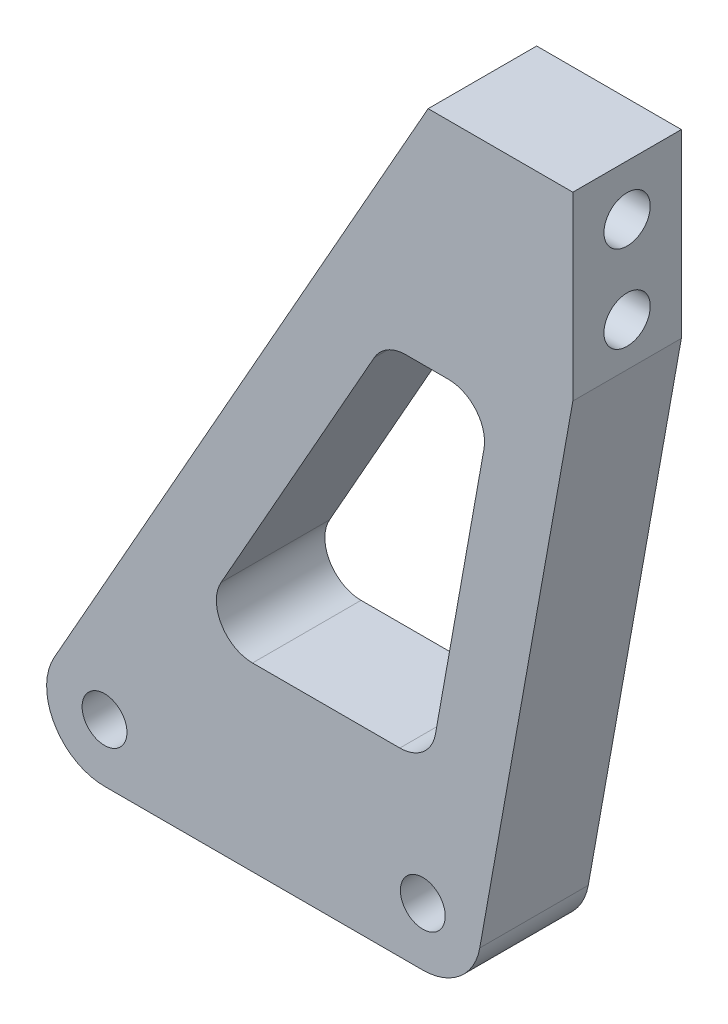
ISO-10303-21;
HEADER;
FILE_DESCRIPTION(('STEP AP214'),'2;1');
FILE_NAME('part.step','',(''),(''),'','','');
FILE_SCHEMA(('AUTOMOTIVE_DESIGN { 1 0 10303 214 1 1 1 1 }'));
ENDSEC;
DATA;
#1=APPLICATION_CONTEXT('core data for automotive mechanical design processes');
#2=APPLICATION_PROTOCOL_DEFINITION('international standard','automotive_design',2000,#1);
#3=PRODUCT_CONTEXT('',#1,'mechanical');
#4=PRODUCT('Part','Part','',(#3));
#5=PRODUCT_RELATED_PRODUCT_CATEGORY('part','',(#4));
#6=PRODUCT_DEFINITION_FORMATION('','',#4);
#7=PRODUCT_DEFINITION_CONTEXT('part definition',#1,'design');
#8=PRODUCT_DEFINITION('design','',#6,#7);
#9=PRODUCT_DEFINITION_SHAPE('','',#8);
#10=(LENGTH_UNIT() NAMED_UNIT(*) SI_UNIT(.MILLI.,.METRE.));
#11=(NAMED_UNIT(*) PLANE_ANGLE_UNIT() SI_UNIT($,.RADIAN.));
#12=(NAMED_UNIT(*) SI_UNIT($,.STERADIAN.) SOLID_ANGLE_UNIT());
#13=UNCERTAINTY_MEASURE_WITH_UNIT(LENGTH_MEASURE(1.E-05),#10,'distance_accuracy_value','');
#14=(GEOMETRIC_REPRESENTATION_CONTEXT(3) GLOBAL_UNCERTAINTY_ASSIGNED_CONTEXT((#13)) GLOBAL_UNIT_ASSIGNED_CONTEXT((#10,
#11,#12)) REPRESENTATION_CONTEXT('',''));
#15=CARTESIAN_POINT('',(0.,0.,0.));
#16=DIRECTION('',(0.,0.,1.));
#17=DIRECTION('',(1.,0.,0.));
#18=AXIS2_PLACEMENT_3D('',#15,#16,#17);
#19=CARTESIAN_POINT('',(11.,0.,7.5));
#20=DIRECTION('',(0.,0.,-1.));
#21=DIRECTION('',(-1.,0.,0.));
#22=AXIS2_PLACEMENT_3D('',#19,#20,#21);
#23=CYLINDRICAL_SURFACE('',#22,4.);
#24=DIRECTION('',(0.,0.,1.));
#25=VECTOR('',#24,1.);
#26=CARTESIAN_POINT('',(14.9374811143085,-0.704444798734167,-60.2766468081744));
#27=LINE('',#26,#25);
#28=CARTESIAN_POINT('',(14.9374811143085,-0.704444798734167,0.));
#29=VERTEX_POINT('',#28);
#30=CARTESIAN_POINT('',(14.9374811143085,-0.704444798734167,7.5));
#31=VERTEX_POINT('',#30);
#32=EDGE_CURVE('E181',#29,#31,#27,.T.);
#33=ORIENTED_EDGE('',*,*,#32,.T.);
#34=CARTESIAN_POINT('',(11.,0.,7.5));
#35=DIRECTION('',(0.,0.,1.));
#36=DIRECTION('',(1.,0.,0.));
#37=AXIS2_PLACEMENT_3D('',#34,#35,#36);
#38=CIRCLE('',#37,4.);
#39=CARTESIAN_POINT('',(11.,-3.99999999999999,7.5));
#40=VERTEX_POINT('',#39);
#41=EDGE_CURVE('E170',#40,#31,#38,.T.);
#42=ORIENTED_EDGE('',*,*,#41,.F.);
#43=DIRECTION('',(0.,0.,-1.));
#44=VECTOR('',#43,1.);
#45=CARTESIAN_POINT('',(11.,-3.99999999999999,7.5));
#46=LINE('',#45,#44);
#47=CARTESIAN_POINT('',(11.,-3.99999999999999,0.));
#48=VERTEX_POINT('',#47);
#49=EDGE_CURVE('E219',#40,#48,#46,.T.);
#50=ORIENTED_EDGE('',*,*,#49,.T.);
#51=CARTESIAN_POINT('',(11.,0.,0.));
#52=DIRECTION('',(0.,0.,1.));
#53=DIRECTION('',(1.,0.,0.));
#54=AXIS2_PLACEMENT_3D('',#51,#52,#53);
#55=CIRCLE('',#54,4.);
#56=EDGE_CURVE('E214',#48,#29,#55,.T.);
#57=ORIENTED_EDGE('',*,*,#56,.T.);
#58=EDGE_LOOP('',(#33,#42,#50,#57));
#59=FACE_BOUND('',#58,.T.);
#60=ADVANCED_FACE('F34',(#59),#23,.T.);
#61=CARTESIAN_POINT('',(0.,-4.,7.5));
#62=DIRECTION('',(0.,1.,0.));
#63=DIRECTION('',(-1.,0.,0.));
#64=AXIS2_PLACEMENT_3D('',#61,#62,#63);
#65=PLANE('',#64);
#66=DIRECTION('',(1.,0.,0.));
#67=VECTOR('',#66,1.);
#68=CARTESIAN_POINT('',(0.,-4.,0.));
#69=LINE('',#68,#67);
#70=CARTESIAN_POINT('',(-11.,-4.,0.));
#71=VERTEX_POINT('',#70);
#72=EDGE_CURVE('E202',#71,#48,#69,.T.);
#73=ORIENTED_EDGE('',*,*,#72,.T.);
#74=ORIENTED_EDGE('',*,*,#49,.F.);
#75=DIRECTION('',(1.,0.,0.));
#76=VECTOR('',#75,1.);
#77=CARTESIAN_POINT('',(0.,-4.,7.5));
#78=LINE('',#77,#76);
#79=CARTESIAN_POINT('',(-11.,-4.,7.5));
#80=VERTEX_POINT('',#79);
#81=EDGE_CURVE('E205',#80,#40,#78,.T.);
#82=ORIENTED_EDGE('',*,*,#81,.F.);
#83=DIRECTION('',(0.,0.,-1.));
#84=VECTOR('',#83,1.);
#85=CARTESIAN_POINT('',(-11.,-4.,7.5));
#86=LINE('',#85,#84);
#87=EDGE_CURVE('E211',#80,#71,#86,.T.);
#88=ORIENTED_EDGE('',*,*,#87,.T.);
#89=EDGE_LOOP('',(#73,#74,#82,#88));
#90=FACE_BOUND('',#89,.T.);
#91=ADVANCED_FACE('F314',(#90),#65,.F.);
#92=CARTESIAN_POINT('',(-11.,0.,7.5));
#93=DIRECTION('',(0.,0.,-1.));
#94=DIRECTION('',(-1.,0.,0.));
#95=AXIS2_PLACEMENT_3D('',#92,#93,#94);
#96=CYLINDRICAL_SURFACE('',#95,4.);
#97=CARTESIAN_POINT('',(-11.,0.,7.5));
#98=DIRECTION('',(0.,0.,1.));
#99=DIRECTION('',(1.,0.,0.));
#100=AXIS2_PLACEMENT_3D('',#97,#98,#99);
#101=CIRCLE('',#100,4.);
#102=CARTESIAN_POINT('',(-14.4830463096768,1.96682190465907,7.5));
#103=VERTEX_POINT('',#102);
#104=EDGE_CURVE('E209',#103,#80,#101,.T.);
#105=ORIENTED_EDGE('',*,*,#104,.F.);
#106=DIRECTION('',(0.,0.,1.));
#107=VECTOR('',#106,1.);
#108=CARTESIAN_POINT('',(-14.4830463096768,1.96682190465906,-60.2766468081744));
#109=LINE('',#108,#107);
#110=CARTESIAN_POINT('',(-14.4830463096768,1.96682190465907,0.));
#111=VERTEX_POINT('',#110);
#112=EDGE_CURVE('E184',#111,#103,#109,.T.);
#113=ORIENTED_EDGE('',*,*,#112,.F.);
#114=CARTESIAN_POINT('',(-11.,0.,0.));
#115=DIRECTION('',(0.,0.,1.));
#116=DIRECTION('',(1.,0.,0.));
#117=AXIS2_PLACEMENT_3D('',#114,#115,#116);
#118=CIRCLE('',#117,4.);
#119=EDGE_CURVE('E207',#111,#71,#118,.T.);
#120=ORIENTED_EDGE('',*,*,#119,.T.);
#121=ORIENTED_EDGE('',*,*,#87,.F.);
#122=EDGE_LOOP('',(#105,#113,#120,#121));
#123=FACE_BOUND('',#122,.T.);
#124=ADVANCED_FACE('F317',(#123),#96,.T.);
#125=CARTESIAN_POINT('',(0.,0.,7.5));
#126=DIRECTION('',(0.,0.,1.));
#127=DIRECTION('',(1.,0.,0.));
#128=AXIS2_PLACEMENT_3D('',#125,#126,#127);
#129=PLANE('',#128);
#130=DIRECTION('',(-1.,0.,0.));
#131=VECTOR('',#130,1.);
#132=CARTESIAN_POINT('',(15.7538881370518,32.25,7.5));
#133=LINE('',#132,#131);
#134=CARTESIAN_POINT('',(12.7669247319205,32.25,7.5));
#135=VERTEX_POINT('',#134);
#136=CARTESIAN_POINT('',(9.81883076379065,32.25,7.5));
#137=VERTEX_POINT('',#136);
#138=EDGE_CURVE('E262',#135,#137,#133,.T.);
#139=ORIENTED_EDGE('',*,*,#138,.F.);
#140=CARTESIAN_POINT('',(12.7669247319205,29.75,7.5));
#141=DIRECTION('',(0.,0.,1.));
#142=DIRECTION('',(1.,0.,0.));
#143=AXIS2_PLACEMENT_3D('',#140,#141,#142);
#144=CIRCLE('',#143,2.5);
#145=CARTESIAN_POINT('',(15.2278504283633,29.3097220007911,7.5));
#146=VERTEX_POINT('',#145);
#147=EDGE_CURVE('E245',#135,#146,#144,.F.);
#148=ORIENTED_EDGE('',*,*,#147,.T.);
#149=DIRECTION('',(-0.176111199683543,-0.984370278577133,0.));
#150=VECTOR('',#149,1.);
#151=CARTESIAN_POINT('',(15.7538881370518,32.25,7.5));
#152=LINE('',#151,#150);
#153=CARTESIAN_POINT('',(11.8733352972894,10.5597220007911,7.5));
#154=VERTEX_POINT('',#153);
#155=EDGE_CURVE('E288',#146,#154,#152,.T.);
#156=ORIENTED_EDGE('',*,*,#155,.T.);
#157=CARTESIAN_POINT('',(9.41240960084658,11.,7.5));
#158=DIRECTION('',(0.,0.,1.));
#159=DIRECTION('',(1.,0.,0.));
#160=AXIS2_PLACEMENT_3D('',#157,#158,#159);
#161=CIRCLE('',#160,2.5);
#162=CARTESIAN_POINT('',(9.41240960084658,8.5,7.5));
#163=VERTEX_POINT('',#162);
#164=EDGE_CURVE('E241',#154,#163,#161,.F.);
#165=ORIENTED_EDGE('',*,*,#164,.T.);
#166=DIRECTION('',(1.,0.,0.));
#167=VECTOR('',#166,1.);
#168=CARTESIAN_POINT('',(-5.05176263891695,8.5,7.5));
#169=LINE('',#168,#167);
#170=CARTESIAN_POINT('',(-0.769001677569933,8.5,7.5));
#171=VERTEX_POINT('',#170);
#172=EDGE_CURVE('E257',#171,#163,#169,.T.);
#173=ORIENTED_EDGE('',*,*,#172,.F.);
#174=CARTESIAN_POINT('',(-0.769001677569933,11.,7.5));
#175=DIRECTION('',(0.,0.,1.));
#176=DIRECTION('',(1.,0.,0.));
#177=AXIS2_PLACEMENT_3D('',#174,#175,#176);
#178=CIRCLE('',#177,2.5);
#179=CARTESIAN_POINT('',(-2.94590562111794,12.2292636904119,7.5));
#180=VERTEX_POINT('',#179);
#181=EDGE_CURVE('E42',#171,#180,#178,.F.);
#182=ORIENTED_EDGE('',*,*,#181,.T.);
#183=DIRECTION('',(-0.491705476164766,-0.870761577419204,0.));
#184=VECTOR('',#183,1.);
#185=CARTESIAN_POINT('',(8.35949178680646,32.25,7.5));
#186=LINE('',#185,#184);
#187=CARTESIAN_POINT('',(7.64192682024265,30.9792636904119,7.5));
#188=VERTEX_POINT('',#187);
#189=EDGE_CURVE('E255',#188,#180,#186,.T.);
#190=ORIENTED_EDGE('',*,*,#189,.F.);
#191=CARTESIAN_POINT('',(9.81883076379066,29.75,7.5));
#192=DIRECTION('',(0.,0.,1.));
#193=DIRECTION('',(1.,0.,0.));
#194=AXIS2_PLACEMENT_3D('',#191,#192,#193);
#195=CIRCLE('',#194,2.5);
#196=EDGE_CURVE('E249',#188,#137,#195,.F.);
#197=ORIENTED_EDGE('',*,*,#196,.T.);
#198=EDGE_LOOP('',(#139,#148,#156,#165,#173,#182,#190,#197));
#199=FACE_BOUND('',#198,.T.);
#200=DIRECTION('',(-0.491705476164766,-0.870761577419204,0.));
#201=VECTOR('',#200,1.);
#202=CARTESIAN_POINT('',(-11.8235292814822,6.67656250121888,7.5));
#203=LINE('',#202,#201);
#204=CARTESIAN_POINT('',(11.37,47.75,7.5));
#205=VERTEX_POINT('',#204);
#206=EDGE_CURVE('E154',#205,#103,#203,.T.);
#207=ORIENTED_EDGE('',*,*,#206,.T.);
#208=ORIENTED_EDGE('',*,*,#104,.T.);
#209=ORIENTED_EDGE('',*,*,#81,.T.);
#210=ORIENTED_EDGE('',*,*,#41,.T.);
#211=DIRECTION('',(-0.176111199683543,-0.984370278577134,0.));
#212=VECTOR('',#211,1.);
#213=CARTESIAN_POINT('',(14.5963144131148,-2.61138973635763,7.5));
#214=LINE('',#213,#212);
#215=CARTESIAN_POINT('',(21.37,35.25,7.5));
#216=VERTEX_POINT('',#215);
#217=EDGE_CURVE('E148',#216,#31,#214,.T.);
#218=ORIENTED_EDGE('',*,*,#217,.F.);
#219=DIRECTION('',(0.,-1.,0.));
#220=VECTOR('',#219,1.);
#221=CARTESIAN_POINT('',(21.37,0.,7.5));
#222=LINE('',#221,#220);
#223=CARTESIAN_POINT('',(21.37,47.75,7.5));
#224=VERTEX_POINT('',#223);
#225=EDGE_CURVE('E157',#224,#216,#222,.T.);
#226=ORIENTED_EDGE('',*,*,#225,.F.);
#227=DIRECTION('',(-1.,0.,0.));
#228=VECTOR('',#227,1.);
#229=CARTESIAN_POINT('',(0.,47.75,7.5));
#230=LINE('',#229,#228);
#231=EDGE_CURVE('E163',#224,#205,#230,.T.);
#232=ORIENTED_EDGE('',*,*,#231,.T.);
#233=EDGE_LOOP('',(#207,#208,#209,#210,#218,#226,#232));
#234=FACE_BOUND('',#233,.T.);
#235=CARTESIAN_POINT('',(11.,0.,7.5));
#236=DIRECTION('',(0.,0.,-1.));
#237=DIRECTION('',(-1.,0.,0.));
#238=AXIS2_PLACEMENT_3D('',#235,#236,#237);
#239=CIRCLE('',#238,1.55);
#240=CARTESIAN_POINT('',(9.45,0.,7.5));
#241=VERTEX_POINT('',#240);
#242=EDGE_CURVE('E196',#241,#241,#239,.T.);
#243=ORIENTED_EDGE('',*,*,#242,.T.);
#244=EDGE_LOOP('',(#243));
#245=FACE_BOUND('',#244,.T.);
#246=CARTESIAN_POINT('',(-11.,0.,7.5));
#247=DIRECTION('',(0.,0.,1.));
#248=DIRECTION('',(1.,0.,0.));
#249=AXIS2_PLACEMENT_3D('',#246,#247,#248);
#250=CIRCLE('',#249,1.55);
#251=CARTESIAN_POINT('',(-9.45,0.,7.5));
#252=VERTEX_POINT('',#251);
#253=EDGE_CURVE('E195',#252,#252,#250,.T.);
#254=ORIENTED_EDGE('',*,*,#253,.F.);
#255=EDGE_LOOP('',(#254));
#256=FACE_BOUND('',#255,.T.);
#257=ADVANCED_FACE('F167',(#199,#234,#245,#256),#129,.T.);
#258=CARTESIAN_POINT('',(0.,0.,0.));
#259=DIRECTION('',(0.,0.,1.));
#260=DIRECTION('',(1.,0.,0.));
#261=AXIS2_PLACEMENT_3D('',#258,#259,#260);
#262=PLANE('',#261);
#263=DIRECTION('',(-0.176111199683543,-0.984370278577133,0.));
#264=VECTOR('',#263,1.);
#265=CARTESIAN_POINT('',(15.7538881370518,32.25,0.));
#266=LINE('',#265,#264);
#267=CARTESIAN_POINT('',(15.2278504283633,29.3097220007911,0.));
#268=VERTEX_POINT('',#267);
#269=CARTESIAN_POINT('',(11.8733352972894,10.5597220007911,0.));
#270=VERTEX_POINT('',#269);
#271=EDGE_CURVE('E276',#268,#270,#266,.T.);
#272=ORIENTED_EDGE('',*,*,#271,.F.);
#273=CARTESIAN_POINT('',(12.7669247319205,29.75,0.));
#274=DIRECTION('',(0.,0.,1.));
#275=DIRECTION('',(1.,0.,0.));
#276=AXIS2_PLACEMENT_3D('',#273,#274,#275);
#277=CIRCLE('',#276,2.5);
#278=CARTESIAN_POINT('',(12.7669247319205,32.25,0.));
#279=VERTEX_POINT('',#278);
#280=EDGE_CURVE('E247',#268,#279,#277,.T.);
#281=ORIENTED_EDGE('',*,*,#280,.T.);
#282=DIRECTION('',(-1.,0.,0.));
#283=VECTOR('',#282,1.);
#284=CARTESIAN_POINT('',(15.7538881370518,32.25,0.));
#285=LINE('',#284,#283);
#286=CARTESIAN_POINT('',(9.81883076379065,32.25,0.));
#287=VERTEX_POINT('',#286);
#288=EDGE_CURVE('E281',#279,#287,#285,.T.);
#289=ORIENTED_EDGE('',*,*,#288,.T.);
#290=CARTESIAN_POINT('',(9.81883076379066,29.75,0.));
#291=DIRECTION('',(0.,0.,1.));
#292=DIRECTION('',(1.,0.,0.));
#293=AXIS2_PLACEMENT_3D('',#290,#291,#292);
#294=CIRCLE('',#293,2.5);
#295=CARTESIAN_POINT('',(7.64192682024265,30.9792636904119,0.));
#296=VERTEX_POINT('',#295);
#297=EDGE_CURVE('E56',#287,#296,#294,.T.);
#298=ORIENTED_EDGE('',*,*,#297,.T.);
#299=DIRECTION('',(-0.491705476164766,-0.870761577419204,0.));
#300=VECTOR('',#299,1.);
#301=CARTESIAN_POINT('',(8.35949178680646,32.25,0.));
#302=LINE('',#301,#300);
#303=CARTESIAN_POINT('',(-2.94590562111794,12.2292636904119,0.));
#304=VERTEX_POINT('',#303);
#305=EDGE_CURVE('E272',#296,#304,#302,.T.);
#306=ORIENTED_EDGE('',*,*,#305,.T.);
#307=CARTESIAN_POINT('',(-0.769001677569933,11.,0.));
#308=DIRECTION('',(0.,0.,1.));
#309=DIRECTION('',(1.,0.,0.));
#310=AXIS2_PLACEMENT_3D('',#307,#308,#309);
#311=CIRCLE('',#310,2.5);
#312=CARTESIAN_POINT('',(-0.769001677569933,8.5,0.));
#313=VERTEX_POINT('',#312);
#314=EDGE_CURVE('E11',#304,#313,#311,.T.);
#315=ORIENTED_EDGE('',*,*,#314,.T.);
#316=DIRECTION('',(1.,0.,0.));
#317=VECTOR('',#316,1.);
#318=CARTESIAN_POINT('',(-5.05176263891695,8.5,0.));
#319=LINE('',#318,#317);
#320=CARTESIAN_POINT('',(9.41240960084658,8.5,0.));
#321=VERTEX_POINT('',#320);
#322=EDGE_CURVE('E270',#313,#321,#319,.T.);
#323=ORIENTED_EDGE('',*,*,#322,.T.);
#324=CARTESIAN_POINT('',(9.41240960084658,11.,0.));
#325=DIRECTION('',(0.,0.,1.));
#326=DIRECTION('',(1.,0.,0.));
#327=AXIS2_PLACEMENT_3D('',#324,#325,#326);
#328=CIRCLE('',#327,2.5);
#329=EDGE_CURVE('E243',#321,#270,#328,.T.);
#330=ORIENTED_EDGE('',*,*,#329,.T.);
#331=EDGE_LOOP('',(#272,#281,#289,#298,#306,#315,#323,#330));
#332=FACE_BOUND('',#331,.T.);
#333=ORIENTED_EDGE('',*,*,#119,.F.);
#334=DIRECTION('',(0.491705476164766,0.870761577419204,0.));
#335=VECTOR('',#334,1.);
#336=CARTESIAN_POINT('',(-11.8235292814822,6.67656250121888,0.));
#337=LINE('',#336,#335);
#338=CARTESIAN_POINT('',(11.37,47.75,0.));
#339=VERTEX_POINT('',#338);
#340=EDGE_CURVE('E298',#111,#339,#337,.T.);
#341=ORIENTED_EDGE('',*,*,#340,.T.);
#342=DIRECTION('',(1.,0.,0.));
#343=VECTOR('',#342,1.);
#344=CARTESIAN_POINT('',(0.,47.75,0.));
#345=LINE('',#344,#343);
#346=CARTESIAN_POINT('',(21.37,47.75,0.));
#347=VERTEX_POINT('',#346);
#348=EDGE_CURVE('E191',#339,#347,#345,.T.);
#349=ORIENTED_EDGE('',*,*,#348,.T.);
#350=DIRECTION('',(0.,1.,0.));
#351=VECTOR('',#350,1.);
#352=CARTESIAN_POINT('',(21.37,0.,0.));
#353=LINE('',#352,#351);
#354=CARTESIAN_POINT('',(21.37,35.25,0.));
#355=VERTEX_POINT('',#354);
#356=EDGE_CURVE('E183',#355,#347,#353,.T.);
#357=ORIENTED_EDGE('',*,*,#356,.F.);
#358=DIRECTION('',(0.176111199683543,0.984370278577134,0.));
#359=VECTOR('',#358,1.);
#360=CARTESIAN_POINT('',(14.5963144131148,-2.61138973635763,0.));
#361=LINE('',#360,#359);
#362=EDGE_CURVE('E150',#29,#355,#361,.T.);
#363=ORIENTED_EDGE('',*,*,#362,.F.);
#364=ORIENTED_EDGE('',*,*,#56,.F.);
#365=ORIENTED_EDGE('',*,*,#72,.F.);
#366=EDGE_LOOP('',(#333,#341,#349,#357,#363,#364,#365));
#367=FACE_BOUND('',#366,.T.);
#368=CARTESIAN_POINT('',(11.,0.,0.));
#369=DIRECTION('',(0.,0.,-1.));
#370=DIRECTION('',(-1.,0.,0.));
#371=AXIS2_PLACEMENT_3D('',#368,#369,#370);
#372=CIRCLE('',#371,1.55);
#373=CARTESIAN_POINT('',(9.45,0.,0.));
#374=VERTEX_POINT('',#373);
#375=EDGE_CURVE('E192',#374,#374,#372,.T.);
#376=ORIENTED_EDGE('',*,*,#375,.F.);
#377=EDGE_LOOP('',(#376));
#378=FACE_BOUND('',#377,.T.);
#379=CARTESIAN_POINT('',(-11.,0.,0.));
#380=DIRECTION('',(0.,0.,1.));
#381=DIRECTION('',(1.,0.,0.));
#382=AXIS2_PLACEMENT_3D('',#379,#380,#381);
#383=CIRCLE('',#382,1.55);
#384=CARTESIAN_POINT('',(-9.45,0.,0.));
#385=VERTEX_POINT('',#384);
#386=EDGE_CURVE('E199',#385,#385,#383,.T.);
#387=ORIENTED_EDGE('',*,*,#386,.T.);
#388=EDGE_LOOP('',(#387));
#389=FACE_BOUND('',#388,.T.);
#390=ADVANCED_FACE('F268',(#332,#367,#378,#389),#262,.F.);
#391=CARTESIAN_POINT('',(-11.,0.,0.));
#392=DIRECTION('',(0.,0.,1.));
#393=DIRECTION('',(1.,0.,0.));
#394=AXIS2_PLACEMENT_3D('',#391,#392,#393);
#395=CYLINDRICAL_SURFACE('',#394,1.55);
#396=ORIENTED_EDGE('',*,*,#386,.F.);
#397=EDGE_LOOP('',(#396));
#398=FACE_BOUND('',#397,.T.);
#399=ORIENTED_EDGE('',*,*,#253,.T.);
#400=EDGE_LOOP('',(#399));
#401=FACE_BOUND('',#400,.T.);
#402=ADVANCED_FACE('F388',(#398,#401),#395,.F.);
#403=CARTESIAN_POINT('',(11.,0.,0.));
#404=DIRECTION('',(0.,0.,1.));
#405=DIRECTION('',(1.,0.,0.));
#406=AXIS2_PLACEMENT_3D('',#403,#404,#405);
#407=CYLINDRICAL_SURFACE('',#406,1.55);
#408=ORIENTED_EDGE('',*,*,#375,.T.);
#409=EDGE_LOOP('',(#408));
#410=FACE_BOUND('',#409,.T.);
#411=ORIENTED_EDGE('',*,*,#242,.F.);
#412=EDGE_LOOP('',(#411));
#413=FACE_BOUND('',#412,.T.);
#414=ADVANCED_FACE('F382',(#410,#413),#407,.F.);
#415=CARTESIAN_POINT('',(21.37,0.,-60.2766468081744));
#416=DIRECTION('',(-1.,0.,0.));
#417=DIRECTION('',(0.,0.,1.));
#418=AXIS2_PLACEMENT_3D('',#415,#416,#417);
#419=PLANE('',#418);
#420=CARTESIAN_POINT('',(21.37,44.25,3.75));
#421=DIRECTION('',(1.,0.,0.));
#422=DIRECTION('',(0.,0.,-1.));
#423=AXIS2_PLACEMENT_3D('',#420,#421,#422);
#424=CIRCLE('',#423,1.6);
#425=CARTESIAN_POINT('',(21.37,44.25,2.15));
#426=VERTEX_POINT('',#425);
#427=EDGE_CURVE('E279',#426,#426,#424,.T.);
#428=ORIENTED_EDGE('',*,*,#427,.F.);
#429=EDGE_LOOP('',(#428));
#430=FACE_BOUND('',#429,.T.);
#431=CARTESIAN_POINT('',(21.37,38.25,3.75));
#432=DIRECTION('',(1.,0.,0.));
#433=DIRECTION('',(0.,0.,-1.));
#434=AXIS2_PLACEMENT_3D('',#431,#432,#433);
#435=CIRCLE('',#434,1.6);
#436=CARTESIAN_POINT('',(21.37,38.25,2.15));
#437=VERTEX_POINT('',#436);
#438=EDGE_CURVE('E174',#437,#437,#435,.T.);
#439=ORIENTED_EDGE('',*,*,#438,.F.);
#440=EDGE_LOOP('',(#439));
#441=FACE_BOUND('',#440,.T.);
#442=DIRECTION('',(0.,0.,1.));
#443=VECTOR('',#442,1.);
#444=CARTESIAN_POINT('',(21.37,35.25,-60.2766468081744));
#445=LINE('',#444,#443);
#446=EDGE_CURVE('E143',#355,#216,#445,.T.);
#447=ORIENTED_EDGE('',*,*,#446,.F.);
#448=ORIENTED_EDGE('',*,*,#356,.T.);
#449=DIRECTION('',(0.,0.,1.));
#450=VECTOR('',#449,1.);
#451=CARTESIAN_POINT('',(21.37,47.75,-60.2766468081744));
#452=LINE('',#451,#450);
#453=EDGE_CURVE('E153',#347,#224,#452,.T.);
#454=ORIENTED_EDGE('',*,*,#453,.T.);
#455=ORIENTED_EDGE('',*,*,#225,.T.);
#456=EDGE_LOOP('',(#447,#448,#454,#455));
#457=FACE_BOUND('',#456,.T.);
#458=ADVANCED_FACE('F158',(#430,#441,#457),#419,.F.);
#459=CARTESIAN_POINT('',(0.,47.75,-60.2766468081744));
#460=DIRECTION('',(0.,1.,0.));
#461=DIRECTION('',(-1.,0.,0.));
#462=AXIS2_PLACEMENT_3D('',#459,#460,#461);
#463=PLANE('',#462);
#464=ORIENTED_EDGE('',*,*,#348,.F.);
#465=DIRECTION('',(0.,0.,1.));
#466=VECTOR('',#465,1.);
#467=CARTESIAN_POINT('',(11.37,47.75,-60.2766468081744));
#468=LINE('',#467,#466);
#469=EDGE_CURVE('E187',#339,#205,#468,.T.);
#470=ORIENTED_EDGE('',*,*,#469,.T.);
#471=ORIENTED_EDGE('',*,*,#231,.F.);
#472=ORIENTED_EDGE('',*,*,#453,.F.);
#473=EDGE_LOOP('',(#464,#470,#471,#472));
#474=FACE_BOUND('',#473,.T.);
#475=ADVANCED_FACE('F309',(#474),#463,.T.);
#476=CARTESIAN_POINT('',(-11.8235292814822,6.67656250121888,-60.2766468081744));
#477=DIRECTION('',(-0.870761577419204,0.491705476164766,0.));
#478=DIRECTION('',(-0.491705476164766,-0.870761577419204,0.));
#479=AXIS2_PLACEMENT_3D('',#476,#477,#478);
#480=PLANE('',#479);
#481=CARTESIAN_POINT('',(9.39360461094604,44.25,3.75));
#482=DIRECTION('',(-0.870761577419204,0.491705476164766,0.));
#483=DIRECTION('',(0.491705476164766,0.870761577419204,0.));
#484=AXIS2_PLACEMENT_3D('',#481,#482,#483);
#485=ELLIPSE('',#484,1.83747198026599,1.6);
#486=CARTESIAN_POINT('',(10.2970996459421,45.85,3.75));
#487=VERTEX_POINT('',#486);
#488=EDGE_CURVE('E293',#487,#487,#485,.F.);
#489=ORIENTED_EDGE('',*,*,#488,.T.);
#490=EDGE_LOOP('',(#489));
#491=FACE_BOUND('',#490,.T.);
#492=CARTESIAN_POINT('',(6.00549822971066,38.25,3.75));
#493=DIRECTION('',(-0.870761577419204,0.491705476164766,0.));
#494=DIRECTION('',(0.491705476164766,0.870761577419204,0.));
#495=AXIS2_PLACEMENT_3D('',#492,#493,#494);
#496=ELLIPSE('',#495,1.83747198026599,1.6);
#497=CARTESIAN_POINT('',(6.90899326470676,39.85,3.75));
#498=VERTEX_POINT('',#497);
#499=EDGE_CURVE('E171',#498,#498,#496,.F.);
#500=ORIENTED_EDGE('',*,*,#499,.T.);
#501=EDGE_LOOP('',(#500));
#502=FACE_BOUND('',#501,.T.);
#503=ORIENTED_EDGE('',*,*,#340,.F.);
#504=ORIENTED_EDGE('',*,*,#112,.T.);
#505=ORIENTED_EDGE('',*,*,#206,.F.);
#506=ORIENTED_EDGE('',*,*,#469,.F.);
#507=EDGE_LOOP('',(#503,#504,#505,#506));
#508=FACE_BOUND('',#507,.T.);
#509=ADVANCED_FACE('F307',(#491,#502,#508),#480,.T.);
#510=CARTESIAN_POINT('',(14.5963144131148,-2.61138973635763,-60.2766468081744));
#511=DIRECTION('',(-0.984370278577134,0.176111199683543,0.));
#512=DIRECTION('',(-0.176111199683543,-0.984370278577134,0.));
#513=AXIS2_PLACEMENT_3D('',#510,#511,#512);
#514=PLANE('',#513);
#515=ORIENTED_EDGE('',*,*,#32,.F.);
#516=ORIENTED_EDGE('',*,*,#362,.T.);
#517=ORIENTED_EDGE('',*,*,#446,.T.);
#518=ORIENTED_EDGE('',*,*,#217,.T.);
#519=EDGE_LOOP('',(#515,#516,#517,#518));
#520=FACE_BOUND('',#519,.T.);
#521=ADVANCED_FACE('F146',(#520),#514,.F.);
#522=CARTESIAN_POINT('',(1.144178734941,38.25,3.75));
#523=DIRECTION('',(1.,0.,0.));
#524=DIRECTION('',(0.,0.,-1.));
#525=AXIS2_PLACEMENT_3D('',#522,#523,#524);
#526=CYLINDRICAL_SURFACE('',#525,1.6);
#527=ORIENTED_EDGE('',*,*,#438,.T.);
#528=EDGE_LOOP('',(#527));
#529=FACE_BOUND('',#528,.T.);
#530=ORIENTED_EDGE('',*,*,#499,.F.);
#531=EDGE_LOOP('',(#530));
#532=FACE_BOUND('',#531,.T.);
#533=ADVANCED_FACE('F370',(#529,#532),#526,.F.);
#534=CARTESIAN_POINT('',(1.144178734941,44.25,3.75));
#535=DIRECTION('',(1.,0.,0.));
#536=DIRECTION('',(0.,0.,-1.));
#537=AXIS2_PLACEMENT_3D('',#534,#535,#536);
#538=CYLINDRICAL_SURFACE('',#537,1.6);
#539=ORIENTED_EDGE('',*,*,#427,.T.);
#540=EDGE_LOOP('',(#539));
#541=FACE_BOUND('',#540,.T.);
#542=ORIENTED_EDGE('',*,*,#488,.F.);
#543=EDGE_LOOP('',(#542));
#544=FACE_BOUND('',#543,.T.);
#545=ADVANCED_FACE('F363',(#541,#544),#538,.F.);
#546=CARTESIAN_POINT('',(15.7538881370518,32.25,0.));
#547=DIRECTION('',(0.,1.,0.));
#548=DIRECTION('',(-1.,0.,0.));
#549=AXIS2_PLACEMENT_3D('',#546,#547,#548);
#550=PLANE('',#549);
#551=ORIENTED_EDGE('',*,*,#288,.F.);
#552=DIRECTION('',(0.,0.,1.));
#553=VECTOR('',#552,1.);
#554=CARTESIAN_POINT('',(12.7669247319205,32.25,0.));
#555=LINE('',#554,#553);
#556=EDGE_CURVE('E234',#279,#135,#555,.T.);
#557=ORIENTED_EDGE('',*,*,#556,.T.);
#558=ORIENTED_EDGE('',*,*,#138,.T.);
#559=DIRECTION('',(0.,0.,1.));
#560=VECTOR('',#559,1.);
#561=CARTESIAN_POINT('',(9.81883076379065,32.25,0.));
#562=LINE('',#561,#560);
#563=EDGE_CURVE('E232',#137,#287,#562,.F.);
#564=ORIENTED_EDGE('',*,*,#563,.T.);
#565=EDGE_LOOP('',(#551,#557,#558,#564));
#566=FACE_BOUND('',#565,.T.);
#567=ADVANCED_FACE('F348',(#566),#550,.F.);
#568=CARTESIAN_POINT('',(15.7538881370518,32.25,0.));
#569=DIRECTION('',(-0.984370278577133,0.176111199683543,0.));
#570=DIRECTION('',(-0.176111199683543,-0.984370278577134,0.));
#571=AXIS2_PLACEMENT_3D('',#568,#569,#570);
#572=PLANE('',#571);
#573=ORIENTED_EDGE('',*,*,#271,.T.);
#574=DIRECTION('',(0.,0.,1.));
#575=VECTOR('',#574,1.);
#576=CARTESIAN_POINT('',(11.8733352972894,10.5597220007911,0.));
#577=LINE('',#576,#575);
#578=EDGE_CURVE('E224',#270,#154,#577,.T.);
#579=ORIENTED_EDGE('',*,*,#578,.T.);
#580=ORIENTED_EDGE('',*,*,#155,.F.);
#581=DIRECTION('',(0.,0.,1.));
#582=VECTOR('',#581,1.);
#583=CARTESIAN_POINT('',(15.2278504283633,29.3097220007911,0.));
#584=LINE('',#583,#582);
#585=EDGE_CURVE('E222',#146,#268,#584,.F.);
#586=ORIENTED_EDGE('',*,*,#585,.T.);
#587=EDGE_LOOP('',(#573,#579,#580,#586));
#588=FACE_BOUND('',#587,.T.);
#589=ADVANCED_FACE('F354',(#588),#572,.T.);
#590=CARTESIAN_POINT('',(-5.05176263891695,8.5,0.));
#591=DIRECTION('',(0.,-1.,0.));
#592=DIRECTION('',(0.,0.,-1.));
#593=AXIS2_PLACEMENT_3D('',#590,#591,#592);
#594=PLANE('',#593);
#595=ORIENTED_EDGE('',*,*,#172,.T.);
#596=DIRECTION('',(0.,0.,1.));
#597=VECTOR('',#596,1.);
#598=CARTESIAN_POINT('',(9.41240960084658,8.5,0.));
#599=LINE('',#598,#597);
#600=EDGE_CURVE('E230',#163,#321,#599,.F.);
#601=ORIENTED_EDGE('',*,*,#600,.T.);
#602=ORIENTED_EDGE('',*,*,#322,.F.);
#603=DIRECTION('',(0.,0.,1.));
#604=VECTOR('',#603,1.);
#605=CARTESIAN_POINT('',(-0.769001677569933,8.5,7.5));
#606=LINE('',#605,#604);
#607=EDGE_CURVE('E227',#313,#171,#606,.T.);
#608=ORIENTED_EDGE('',*,*,#607,.T.);
#609=EDGE_LOOP('',(#595,#601,#602,#608));
#610=FACE_BOUND('',#609,.T.);
#611=ADVANCED_FACE('F274',(#610),#594,.F.);
#612=CARTESIAN_POINT('',(8.35949178680646,32.25,0.));
#613=DIRECTION('',(-0.870761577419204,0.491705476164766,0.));
#614=DIRECTION('',(-0.491705476164766,-0.870761577419204,0.));
#615=AXIS2_PLACEMENT_3D('',#612,#613,#614);
#616=PLANE('',#615);
#617=ORIENTED_EDGE('',*,*,#305,.F.);
#618=DIRECTION('',(0.,0.,1.));
#619=VECTOR('',#618,1.);
#620=CARTESIAN_POINT('',(7.64192682024265,30.9792636904119,7.5));
#621=LINE('',#620,#619);
#622=EDGE_CURVE('E238',#296,#188,#621,.T.);
#623=ORIENTED_EDGE('',*,*,#622,.T.);
#624=ORIENTED_EDGE('',*,*,#189,.T.);
#625=DIRECTION('',(0.,0.,1.));
#626=VECTOR('',#625,1.);
#627=CARTESIAN_POINT('',(-2.94590562111794,12.2292636904119,0.));
#628=LINE('',#627,#626);
#629=EDGE_CURVE('E49',#180,#304,#628,.F.);
#630=ORIENTED_EDGE('',*,*,#629,.T.);
#631=EDGE_LOOP('',(#617,#623,#624,#630));
#632=FACE_BOUND('',#631,.T.);
#633=ADVANCED_FACE('F260',(#632),#616,.F.);
#634=CARTESIAN_POINT('',(9.41240960084658,11.,0.));
#635=DIRECTION('',(0.,0.,1.));
#636=DIRECTION('',(1.,0.,0.));
#637=AXIS2_PLACEMENT_3D('',#634,#635,#636);
#638=CYLINDRICAL_SURFACE('',#637,2.5);
#639=ORIENTED_EDGE('',*,*,#329,.F.);
#640=ORIENTED_EDGE('',*,*,#600,.F.);
#641=ORIENTED_EDGE('',*,*,#164,.F.);
#642=ORIENTED_EDGE('',*,*,#578,.F.);
#643=EDGE_LOOP('',(#639,#640,#641,#642));
#644=FACE_BOUND('',#643,.T.);
#645=ADVANCED_FACE('F332',(#644),#638,.F.);
#646=CARTESIAN_POINT('',(12.7669247319205,29.75,0.));
#647=DIRECTION('',(0.,0.,1.));
#648=DIRECTION('',(1.,0.,0.));
#649=AXIS2_PLACEMENT_3D('',#646,#647,#648);
#650=CYLINDRICAL_SURFACE('',#649,2.5);
#651=ORIENTED_EDGE('',*,*,#280,.F.);
#652=ORIENTED_EDGE('',*,*,#585,.F.);
#653=ORIENTED_EDGE('',*,*,#147,.F.);
#654=ORIENTED_EDGE('',*,*,#556,.F.);
#655=EDGE_LOOP('',(#651,#652,#653,#654));
#656=FACE_BOUND('',#655,.T.);
#657=ADVANCED_FACE('F335',(#656),#650,.F.);
#658=CARTESIAN_POINT('',(9.81883076379066,29.75,0.));
#659=DIRECTION('',(0.,0.,-1.));
#660=DIRECTION('',(-1.,0.,0.));
#661=AXIS2_PLACEMENT_3D('',#658,#659,#660);
#662=CYLINDRICAL_SURFACE('',#661,2.5);
#663=ORIENTED_EDGE('',*,*,#297,.F.);
#664=ORIENTED_EDGE('',*,*,#563,.F.);
#665=ORIENTED_EDGE('',*,*,#196,.F.);
#666=ORIENTED_EDGE('',*,*,#622,.F.);
#667=EDGE_LOOP('',(#663,#664,#665,#666));
#668=FACE_BOUND('',#667,.T.);
#669=ADVANCED_FACE('F338',(#668),#662,.F.);
#670=CARTESIAN_POINT('',(-0.769001677569933,11.,0.));
#671=DIRECTION('',(0.,0.,-1.));
#672=DIRECTION('',(-1.,0.,0.));
#673=AXIS2_PLACEMENT_3D('',#670,#671,#672);
#674=CYLINDRICAL_SURFACE('',#673,2.5);
#675=ORIENTED_EDGE('',*,*,#314,.F.);
#676=ORIENTED_EDGE('',*,*,#629,.F.);
#677=ORIENTED_EDGE('',*,*,#181,.F.);
#678=ORIENTED_EDGE('',*,*,#607,.F.);
#679=EDGE_LOOP('',(#675,#676,#677,#678));
#680=FACE_BOUND('',#679,.T.);
#681=ADVANCED_FACE('F36',(#680),#674,.F.);
#682=CLOSED_SHELL('',(#60,#91,#124,#257,#390,#402,#414,#458,#475,#509,#521,#533,#545,#567,#589,
#611,#633,#645,#657,#669,#681));
#683=MANIFOLD_SOLID_BREP('B2',#682);
#684=ADVANCED_BREP_SHAPE_REPRESENTATION('',(#18,#683),#14);
#685=SHAPE_DEFINITION_REPRESENTATION(#9,#684);
ENDSEC;
END-ISO-10303-21;
